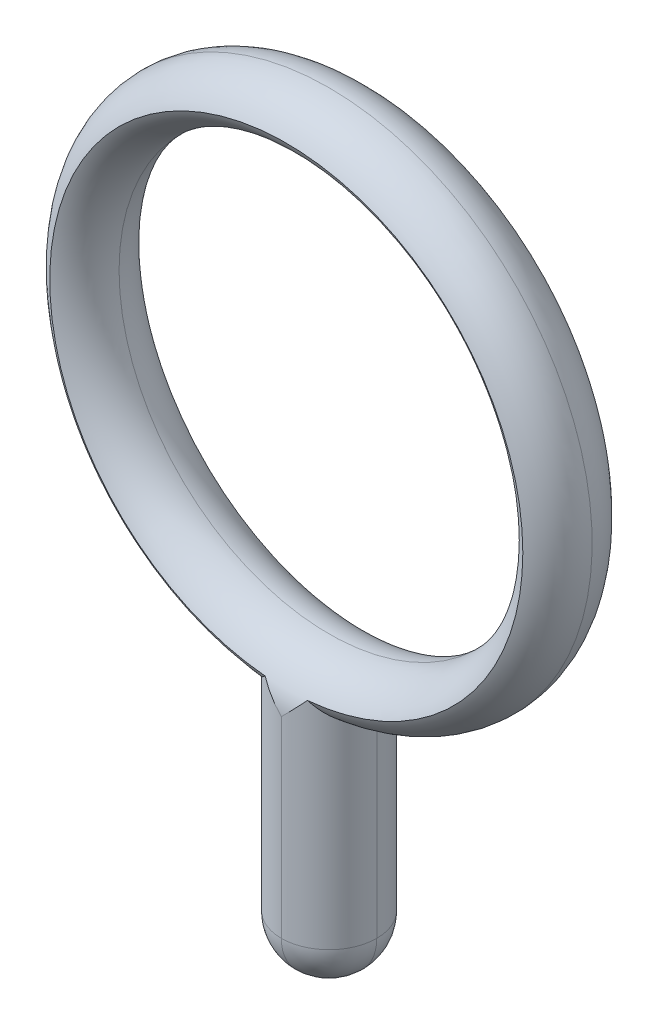
ISO-10303-21;
HEADER;
FILE_DESCRIPTION(('STEP AP214'),'2;1');
FILE_NAME('part.step','',(''),(''),'','','');
FILE_SCHEMA(('AUTOMOTIVE_DESIGN { 1 0 10303 214 1 1 1 1 }'));
ENDSEC;
DATA;
#1=APPLICATION_CONTEXT('core data for automotive mechanical design processes');
#2=APPLICATION_PROTOCOL_DEFINITION('international standard','automotive_design',2000,#1);
#3=PRODUCT_CONTEXT('',#1,'mechanical');
#4=PRODUCT('Part','Part','',(#3));
#5=PRODUCT_RELATED_PRODUCT_CATEGORY('part','',(#4));
#6=PRODUCT_DEFINITION_FORMATION('','',#4);
#7=PRODUCT_DEFINITION_CONTEXT('part definition',#1,'design');
#8=PRODUCT_DEFINITION('design','',#6,#7);
#9=PRODUCT_DEFINITION_SHAPE('','',#8);
#10=(LENGTH_UNIT() NAMED_UNIT(*) SI_UNIT(.MILLI.,.METRE.));
#11=(NAMED_UNIT(*) PLANE_ANGLE_UNIT() SI_UNIT($,.RADIAN.));
#12=(NAMED_UNIT(*) SI_UNIT($,.STERADIAN.) SOLID_ANGLE_UNIT());
#13=UNCERTAINTY_MEASURE_WITH_UNIT(LENGTH_MEASURE(1.E-05),#10,'distance_accuracy_value','');
#14=(GEOMETRIC_REPRESENTATION_CONTEXT(3) GLOBAL_UNCERTAINTY_ASSIGNED_CONTEXT((#13)) GLOBAL_UNIT_ASSIGNED_CONTEXT((#10,
#11,#12)) REPRESENTATION_CONTEXT('',''));
#15=CARTESIAN_POINT('',(0.,0.,0.));
#16=DIRECTION('',(0.,0.,1.));
#17=DIRECTION('',(1.,0.,0.));
#18=AXIS2_PLACEMENT_3D('',#15,#16,#17);
#19=CARTESIAN_POINT('',(0.,0.,2.5));
#20=DIRECTION('',(0.,0.,1.));
#21=DIRECTION('',(1.,0.,0.));
#22=AXIS2_PLACEMENT_3D('',#19,#20,#21);
#23=PLANE('',#22);
#24=DIRECTION('',(0.,1.,0.));
#25=VECTOR('',#24,1.);
#26=CARTESIAN_POINT('',(9.99999999978882E-05,-6.77654510339896,2.5));
#27=LINE('',#26,#25);
#28=CARTESIAN_POINT('',(9.99999999996231E-05,-11.778649847124,2.5));
#29=VERTEX_POINT('',#28);
#30=CARTESIAN_POINT('',(9.9999999997879E-05,-6.74989999925925,2.5));
#31=VERTEX_POINT('',#30);
#32=EDGE_CURVE('E263',#29,#31,#27,.T.);
#33=ORIENTED_EDGE('',*,*,#32,.T.);
#34=CARTESIAN_POINT('',(0.,0.,2.5));
#35=DIRECTION('',(0.,0.,1.));
#36=DIRECTION('',(1.,0.,0.));
#37=AXIS2_PLACEMENT_3D('',#34,#35,#36);
#38=CIRCLE('',#37,6.7499);
#39=CARTESIAN_POINT('',(-0.000100000000000057,-6.74989999925925,2.5));
#40=VERTEX_POINT('',#39);
#41=EDGE_CURVE('E265',#31,#40,#38,.F.);
#42=ORIENTED_EDGE('',*,*,#41,.T.);
#43=DIRECTION('',(0.,-1.,0.));
#44=VECTOR('',#43,1.);
#45=CARTESIAN_POINT('',(-0.000100000000000057,-13.028549847124,2.5));
#46=LINE('',#45,#44);
#47=CARTESIAN_POINT('',(-0.000100000000000057,-11.778649847124,2.5));
#48=VERTEX_POINT('',#47);
#49=EDGE_CURVE('E261',#40,#48,#46,.T.);
#50=ORIENTED_EDGE('',*,*,#49,.T.);
#51=DIRECTION('',(1.,0.,0.));
#52=VECTOR('',#51,1.);
#53=CARTESIAN_POINT('',(1.25,-11.778649847124,2.5));
#54=LINE('',#53,#52);
#55=EDGE_CURVE('E259',#48,#29,#54,.T.);
#56=ORIENTED_EDGE('',*,*,#55,.T.);
#57=EDGE_LOOP('',(#33,#42,#50,#56));
#58=FACE_BOUND('',#57,.T.);
#59=ADVANCED_FACE('F33',(#58),#23,.T.);
#60=CARTESIAN_POINT('',(0.,0.,0.));
#61=DIRECTION('',(0.,0.,1.));
#62=DIRECTION('',(1.,0.,0.));
#63=AXIS2_PLACEMENT_3D('',#60,#61,#62);
#64=PLANE('',#63);
#65=DIRECTION('',(0.,-1.,0.));
#66=VECTOR('',#65,1.);
#67=CARTESIAN_POINT('',(-0.000100000000000057,0.,0.));
#68=LINE('',#67,#66);
#69=CARTESIAN_POINT('',(-0.000100000000000057,-11.778649847124,0.));
#70=VERTEX_POINT('',#69);
#71=CARTESIAN_POINT('',(-0.000100000000000057,-6.74989999925925,0.));
#72=VERTEX_POINT('',#71);
#73=EDGE_CURVE('E248',#70,#72,#68,.F.);
#74=ORIENTED_EDGE('',*,*,#73,.T.);
#75=CARTESIAN_POINT('',(0.,0.,0.));
#76=DIRECTION('',(0.,0.,1.));
#77=DIRECTION('',(1.,0.,0.));
#78=AXIS2_PLACEMENT_3D('',#75,#76,#77);
#79=CIRCLE('',#78,6.7499);
#80=CARTESIAN_POINT('',(9.9999999997879E-05,-6.74989999925925,0.));
#81=VERTEX_POINT('',#80);
#82=EDGE_CURVE('E251',#72,#81,#79,.T.);
#83=ORIENTED_EDGE('',*,*,#82,.T.);
#84=DIRECTION('',(0.,1.,0.));
#85=VECTOR('',#84,1.);
#86=CARTESIAN_POINT('',(9.99999999955379E-05,0.,0.));
#87=LINE('',#86,#85);
#88=CARTESIAN_POINT('',(9.99999999996231E-05,-11.778649847124,0.));
#89=VERTEX_POINT('',#88);
#90=EDGE_CURVE('E80',#81,#89,#87,.F.);
#91=ORIENTED_EDGE('',*,*,#90,.T.);
#92=DIRECTION('',(1.,0.,0.));
#93=VECTOR('',#92,1.);
#94=CARTESIAN_POINT('',(0.,-11.778649847124,0.));
#95=LINE('',#94,#93);
#96=EDGE_CURVE('E244',#89,#70,#95,.F.);
#97=ORIENTED_EDGE('',*,*,#96,.T.);
#98=EDGE_LOOP('',(#74,#83,#91,#97));
#99=FACE_BOUND('',#98,.T.);
#100=ADVANCED_FACE('F352',(#99),#64,.F.);
#101=CARTESIAN_POINT('',(1.25,-13.028549847124,2.5));
#102=DIRECTION('',(-1.,0.,0.));
#103=DIRECTION('',(0.,-1.,0.));
#104=AXIS2_PLACEMENT_3D('',#101,#102,#103);
#105=PLANE('',#104);
#106=DIRECTION('',(0.,0.,-1.));
#107=VECTOR('',#106,1.);
#108=CARTESIAN_POINT('',(1.25,-11.778649847124,2.5));
#109=LINE('',#108,#107);
#110=CARTESIAN_POINT('',(1.25,-11.778649847124,1.2501));
#111=VERTEX_POINT('',#110);
#112=CARTESIAN_POINT('',(1.25,-11.778649847124,1.2499));
#113=VERTEX_POINT('',#112);
#114=EDGE_CURVE('E268',#111,#113,#109,.T.);
#115=ORIENTED_EDGE('',*,*,#114,.T.);
#116=DIRECTION('',(0.,1.,0.));
#117=VECTOR('',#116,1.);
#118=CARTESIAN_POINT('',(1.25,-13.028549847124,1.2499));
#119=LINE('',#118,#117);
#120=CARTESIAN_POINT('',(1.24999999999999,-6.77654510339896,1.2499));
#121=VERTEX_POINT('',#120);
#122=EDGE_CURVE('E272',#113,#121,#119,.T.);
#123=ORIENTED_EDGE('',*,*,#122,.T.);
#124=DIRECTION('',(0.,0.,-1.));
#125=VECTOR('',#124,1.);
#126=CARTESIAN_POINT('',(1.24999999999999,-6.77654510339896,2.5));
#127=LINE('',#126,#125);
#128=CARTESIAN_POINT('',(1.24999999999999,-6.77654510339896,1.2501));
#129=VERTEX_POINT('',#128);
#130=EDGE_CURVE('E238',#129,#121,#127,.T.);
#131=ORIENTED_EDGE('',*,*,#130,.F.);
#132=DIRECTION('',(0.,1.,0.));
#133=VECTOR('',#132,1.);
#134=CARTESIAN_POINT('',(1.25,-13.028549847124,1.2501));
#135=LINE('',#134,#133);
#136=EDGE_CURVE('E270',#129,#111,#135,.F.);
#137=ORIENTED_EDGE('',*,*,#136,.T.);
#138=EDGE_LOOP('',(#115,#123,#131,#137));
#139=FACE_BOUND('',#138,.T.);
#140=ADVANCED_FACE('F358',(#139),#105,.F.);
#141=CARTESIAN_POINT('',(0.,0.,2.5));
#142=DIRECTION('',(0.,0.,-1.));
#143=DIRECTION('',(-1.,0.,0.));
#144=AXIS2_PLACEMENT_3D('',#141,#142,#143);
#145=CYLINDRICAL_SURFACE('',#144,6.89086812661514);
#146=ORIENTED_EDGE('',*,*,#130,.T.);
#147=CARTESIAN_POINT('',(0.,0.,1.2499));
#148=DIRECTION('',(0.,0.,1.));
#149=DIRECTION('',(1.,0.,0.));
#150=AXIS2_PLACEMENT_3D('',#147,#148,#149);
#151=CIRCLE('',#150,6.89086812661514);
#152=CARTESIAN_POINT('',(-1.25,-6.77654510339896,1.2499));
#153=VERTEX_POINT('',#152);
#154=EDGE_CURVE('E277',#121,#153,#151,.T.);
#155=ORIENTED_EDGE('',*,*,#154,.T.);
#156=DIRECTION('',(0.,0.,-1.));
#157=VECTOR('',#156,1.);
#158=CARTESIAN_POINT('',(-1.25,-6.77654510339896,2.5));
#159=LINE('',#158,#157);
#160=CARTESIAN_POINT('',(-1.25,-6.77654510339896,1.2501));
#161=VERTEX_POINT('',#160);
#162=EDGE_CURVE('E236',#161,#153,#159,.T.);
#163=ORIENTED_EDGE('',*,*,#162,.F.);
#164=CARTESIAN_POINT('',(0.,0.,1.2501));
#165=DIRECTION('',(0.,0.,1.));
#166=DIRECTION('',(1.,0.,0.));
#167=AXIS2_PLACEMENT_3D('',#164,#165,#166);
#168=CIRCLE('',#167,6.89086812661514);
#169=EDGE_CURVE('E275',#161,#129,#168,.F.);
#170=ORIENTED_EDGE('',*,*,#169,.T.);
#171=EDGE_LOOP('',(#146,#155,#163,#170));
#172=FACE_BOUND('',#171,.T.);
#173=ADVANCED_FACE('F367',(#172),#145,.T.);
#174=CARTESIAN_POINT('',(-1.25,-13.028549847124,2.5));
#175=DIRECTION('',(1.,0.,0.));
#176=DIRECTION('',(0.,0.,-1.));
#177=AXIS2_PLACEMENT_3D('',#174,#175,#176);
#178=PLANE('',#177);
#179=ORIENTED_EDGE('',*,*,#162,.T.);
#180=DIRECTION('',(0.,-1.,0.));
#181=VECTOR('',#180,1.);
#182=CARTESIAN_POINT('',(-1.25,-13.028549847124,1.2499));
#183=LINE('',#182,#181);
#184=CARTESIAN_POINT('',(-1.25,-11.778649847124,1.2499));
#185=VERTEX_POINT('',#184);
#186=EDGE_CURVE('E141',#153,#185,#183,.T.);
#187=ORIENTED_EDGE('',*,*,#186,.T.);
#188=DIRECTION('',(0.,0.,-1.));
#189=VECTOR('',#188,1.);
#190=CARTESIAN_POINT('',(-1.25,-11.778649847124,2.5));
#191=LINE('',#190,#189);
#192=CARTESIAN_POINT('',(-1.25,-11.778649847124,1.2501));
#193=VERTEX_POINT('',#192);
#194=EDGE_CURVE('E156',#185,#193,#191,.F.);
#195=ORIENTED_EDGE('',*,*,#194,.T.);
#196=DIRECTION('',(0.,-1.,0.));
#197=VECTOR('',#196,1.);
#198=CARTESIAN_POINT('',(-1.25,-6.77654510339896,1.2501));
#199=LINE('',#198,#197);
#200=EDGE_CURVE('E280',#193,#161,#199,.F.);
#201=ORIENTED_EDGE('',*,*,#200,.T.);
#202=EDGE_LOOP('',(#179,#187,#195,#201));
#203=FACE_BOUND('',#202,.T.);
#204=ADVANCED_FACE('F364',(#203),#178,.F.);
#205=CARTESIAN_POINT('',(-1.25,-13.028549847124,2.5));
#206=DIRECTION('',(0.,1.,0.));
#207=DIRECTION('',(0.,0.,1.));
#208=AXIS2_PLACEMENT_3D('',#205,#206,#207);
#209=PLANE('',#208);
#210=DIRECTION('',(1.,0.,0.));
#211=VECTOR('',#210,1.);
#212=CARTESIAN_POINT('',(-1.25,-13.028549847124,1.2499));
#213=LINE('',#212,#211);
#214=CARTESIAN_POINT('',(-0.000100000000000057,-13.028549847124,1.2499));
#215=VERTEX_POINT('',#214);
#216=CARTESIAN_POINT('',(9.99999999996231E-05,-13.028549847124,1.2499));
#217=VERTEX_POINT('',#216);
#218=EDGE_CURVE('E43',#215,#217,#213,.T.);
#219=ORIENTED_EDGE('',*,*,#218,.T.);
#220=DIRECTION('',(0.,0.,-1.));
#221=VECTOR('',#220,1.);
#222=CARTESIAN_POINT('',(9.9999999999623E-05,-13.028549847124,2.5));
#223=LINE('',#222,#221);
#224=CARTESIAN_POINT('',(9.99999999996231E-05,-13.028549847124,1.2501));
#225=VERTEX_POINT('',#224);
#226=EDGE_CURVE('E11',#217,#225,#223,.F.);
#227=ORIENTED_EDGE('',*,*,#226,.T.);
#228=DIRECTION('',(1.,0.,0.));
#229=VECTOR('',#228,1.);
#230=CARTESIAN_POINT('',(-1.25,-13.028549847124,1.2501));
#231=LINE('',#230,#229);
#232=CARTESIAN_POINT('',(-0.000100000000000057,-13.028549847124,1.2501));
#233=VERTEX_POINT('',#232);
#234=EDGE_CURVE('E136',#225,#233,#231,.F.);
#235=ORIENTED_EDGE('',*,*,#234,.T.);
#236=DIRECTION('',(0.,0.,-1.));
#237=VECTOR('',#236,1.);
#238=CARTESIAN_POINT('',(-0.000100000000000057,-13.028549847124,2.5));
#239=LINE('',#238,#237);
#240=EDGE_CURVE('E132',#233,#215,#239,.T.);
#241=ORIENTED_EDGE('',*,*,#240,.T.);
#242=EDGE_LOOP('',(#219,#227,#235,#241));
#243=FACE_BOUND('',#242,.T.);
#244=ADVANCED_FACE('F134',(#243),#209,.F.);
#245=CARTESIAN_POINT('',(0.,0.,2.5));
#246=DIRECTION('',(0.,0.,-1.));
#247=DIRECTION('',(-1.,0.,0.));
#248=AXIS2_PLACEMENT_3D('',#245,#246,#247);
#249=CYLINDRICAL_SURFACE('',#248,5.5);
#250=CARTESIAN_POINT('',(0.,0.,1.2499));
#251=DIRECTION('',(0.,0.,1.));
#252=DIRECTION('',(1.,0.,0.));
#253=AXIS2_PLACEMENT_3D('',#250,#251,#252);
#254=CIRCLE('',#253,5.5);
#255=CARTESIAN_POINT('',(5.5,0.,1.2499));
#256=VERTEX_POINT('',#255);
#257=EDGE_CURVE('E256',#256,#256,#254,.F.);
#258=ORIENTED_EDGE('',*,*,#257,.T.);
#259=EDGE_LOOP('',(#258));
#260=FACE_BOUND('',#259,.T.);
#261=CARTESIAN_POINT('',(0.,0.,1.2501));
#262=DIRECTION('',(0.,0.,1.));
#263=DIRECTION('',(1.,0.,0.));
#264=AXIS2_PLACEMENT_3D('',#261,#262,#263);
#265=CIRCLE('',#264,5.5);
#266=CARTESIAN_POINT('',(5.5,0.,1.2501));
#267=VERTEX_POINT('',#266);
#268=EDGE_CURVE('E253',#267,#267,#265,.T.);
#269=ORIENTED_EDGE('',*,*,#268,.T.);
#270=EDGE_LOOP('',(#269));
#271=FACE_BOUND('',#270,.T.);
#272=ADVANCED_FACE('F219',(#260,#271),#249,.F.);
#273=CARTESIAN_POINT('',(0.,0.,1.2501));
#274=DIRECTION('',(0.,0.,1.));
#275=DIRECTION('',(1.,0.,0.));
#276=AXIS2_PLACEMENT_3D('',#273,#274,#275);
#277=TOROIDAL_SURFACE('',#276,5.64096812661514,1.2499);
#278=CARTESIAN_POINT('',(0.,0.,2.37028638406641));
#279=DIRECTION('',(0.,0.,1.));
#280=DIRECTION('',(1.,0.,0.));
#281=AXIS2_PLACEMENT_3D('',#278,#279,#280);
#282=CIRCLE('',#281,6.19543406330757);
#283=CARTESIAN_POINT('',(0.554565936692405,-6.17056398189436,2.37028638406642));
#284=VERTEX_POINT('',#283);
#285=CARTESIAN_POINT('',(-0.554565936692431,-6.17056398189438,2.37028638406641));
#286=VERTEX_POINT('',#285);
#287=EDGE_CURVE('E37',#284,#286,#282,.T.);
#288=ORIENTED_EDGE('',*,*,#287,.F.);
#289=CARTESIAN_POINT('',(1.25,-6.77654510339896,1.2501));
#290=CARTESIAN_POINT('',(1.25000302329412,-6.77654708426435,1.27938214554928));
#291=CARTESIAN_POINT('',(1.2489701130916,-6.77568786500602,1.3086477741594));
#292=CARTESIAN_POINT('',(1.24487093556194,-6.77227459535146,1.36692144080503));
#293=CARTESIAN_POINT('',(1.24180575369463,-6.76972144970046,1.3959296079766));
#294=CARTESIAN_POINT('',(1.22967763848456,-6.75961090304189,1.4818546486924));
#295=CARTESIAN_POINT('',(1.21768084748406,-6.74960144347235,1.53810906788582));
#296=CARTESIAN_POINT('',(1.18665734618223,-6.72362354641573,1.64701396782045));
#297=CARTESIAN_POINT('',(1.16764272163082,-6.7076653530601,1.69967046103869));
#298=CARTESIAN_POINT('',(1.12363159370701,-6.67055119125073,1.80051880748827));
#299=CARTESIAN_POINT('',(1.09862541085526,-6.64938681061011,1.84870325947881));
#300=CARTESIAN_POINT('',(1.03526317184712,-6.5954445958544,1.95404967168192));
#301=CARTESIAN_POINT('',(0.995171633918566,-6.56110040746148,2.0093652519799));
#302=CARTESIAN_POINT('',(0.909028179507402,-6.48661713417045,2.11064485938731));
#303=CARTESIAN_POINT('',(0.862967086845452,-6.44646911664006,2.15659420335288));
#304=CARTESIAN_POINT('',(0.751848778132955,-6.34859217702582,2.25211407588086));
#305=CARTESIAN_POINT('',(0.6853398863685,-6.28927954917254,2.29836382876531));
#306=CARTESIAN_POINT('',(0.5486357823578,-6.1654524438389,2.37595614715856));
#307=CARTESIAN_POINT('',(0.478436246621888,-6.10093181574973,2.40728077584774));
#308=CARTESIAN_POINT('',(0.340763594459026,-5.97224423519993,2.45475287101028));
#309=CARTESIAN_POINT('',(0.273367279350015,-5.908272212648,2.47167263283585));
#310=CARTESIAN_POINT('',(0.138798527869245,-5.77836394914129,2.49414782440753));
#311=CARTESIAN_POINT('',(0.0716259073594412,-5.71243150283838,2.49972392169305));
#312=CARTESIAN_POINT('',(0.00343355777977364,-5.64430088965892,2.49999666427235));
#313=CARTESIAN_POINT('',(0.00176657075144899,-5.64263467090914,2.49999999736394));
#314=CARTESIAN_POINT('',(9.99999999974944E-05,-5.64096812572877,2.5));
#315=B_SPLINE_CURVE_WITH_KNOTS('',3,(#289,#290,#291,#292,#293,#294,#295,#296,#297,#298,#299,
#300,#301,#302,#303,#304,#305,#306,#307,#308,#309,#310,#311,#312,#313,#314),.UNSPECIFIED.,.F.,
.F.,(4,2,2,2,2,2,2,2,2,2,2,2,4),(0.,0.0877839200167928,0.175520991354608,0.349703321603657,
0.523587073184519,0.697753654226231,0.925902553066981,1.15440640848641,1.45399965461546,
1.75395204548523,2.03657482013367,2.31868220863177,2.32575300084718),.UNSPECIFIED.);
#316=EDGE_CURVE('E222',#129,#284,#315,.T.);
#317=ORIENTED_EDGE('',*,*,#316,.F.);
#318=ORIENTED_EDGE('',*,*,#169,.F.);
#319=CARTESIAN_POINT('',(-1.25,-6.77654510339896,1.2501));
#320=CARTESIAN_POINT('',(-1.25000302329412,-6.77654708426435,1.27938214554928));
#321=CARTESIAN_POINT('',(-1.2489701130916,-6.77568786500602,1.3086477741594));
#322=CARTESIAN_POINT('',(-1.24487093556194,-6.77227459535146,1.36692144080503));
#323=CARTESIAN_POINT('',(-1.24180575369463,-6.76972144970046,1.3959296079766));
#324=CARTESIAN_POINT('',(-1.22967763848456,-6.75961090304189,1.4818546486924));
#325=CARTESIAN_POINT('',(-1.21768084748407,-6.74960144347235,1.53810906788582));
#326=CARTESIAN_POINT('',(-1.18665734618223,-6.72362354641573,1.64701396782045));
#327=CARTESIAN_POINT('',(-1.16764272163083,-6.7076653530601,1.69967046103869));
#328=CARTESIAN_POINT('',(-1.12363159370701,-6.67055119125072,1.80051880748827));
#329=CARTESIAN_POINT('',(-1.09862541085526,-6.6493868106101,1.84870325947881));
#330=CARTESIAN_POINT('',(-1.03526317184713,-6.5954445958544,1.95404967168192));
#331=CARTESIAN_POINT('',(-0.995171633918569,-6.56110040746148,2.0093652519799));
#332=CARTESIAN_POINT('',(-0.909028179507405,-6.48661713417045,2.11064485938731));
#333=CARTESIAN_POINT('',(-0.862967086845455,-6.44646911664006,2.15659420335288));
#334=CARTESIAN_POINT('',(-0.751848778132957,-6.34859217702582,2.25211407588086));
#335=CARTESIAN_POINT('',(-0.6853398863685,-6.28927954917254,2.29836382876531));
#336=CARTESIAN_POINT('',(-0.548635782357805,-6.1654524438389,2.37595614715856));
#337=CARTESIAN_POINT('',(-0.4784362466219,-6.10093181574972,2.40728077584774));
#338=CARTESIAN_POINT('',(-0.340763594459022,-5.97224423519994,2.45475287101028));
#339=CARTESIAN_POINT('',(-0.27336727934999,-5.90827221264803,2.47167263283585));
#340=CARTESIAN_POINT('',(-0.138798527869277,-5.77836394914127,2.49414782440753));
#341=CARTESIAN_POINT('',(-0.0716259073595519,-5.71243150283827,2.49972392169305));
#342=CARTESIAN_POINT('',(-0.00343355777978153,-5.64430088965892,2.49999666427235));
#343=CARTESIAN_POINT('',(-0.00176657075145428,-5.64263467090913,2.49999999736394));
#344=CARTESIAN_POINT('',(-0.000100000000000057,-5.64096812572877,2.5));
#345=B_SPLINE_CURVE_WITH_KNOTS('',3,(#319,#320,#321,#322,#323,#324,#325,#326,#327,#328,#329,
#330,#331,#332,#333,#334,#335,#336,#337,#338,#339,#340,#341,#342,#343,#344),.UNSPECIFIED.,.F.,
.F.,(4,2,2,2,2,2,2,2,2,2,2,2,4),(0.,0.0877839200167927,0.175520991354608,0.349703321603657,
0.523587073184519,0.69775365422623,0.925902553066979,1.15440640848641,1.45399965461547,
1.75395204548523,2.03657482013366,2.31868220863177,2.32575300084718),.UNSPECIFIED.);
#346=EDGE_CURVE('E198',#286,#161,#345,.F.);
#347=ORIENTED_EDGE('',*,*,#346,.F.);
#348=EDGE_LOOP('',(#288,#317,#318,#347));
#349=FACE_BOUND('',#348,.T.);
#350=ADVANCED_FACE('F216',(#349),#277,.T.);
#351=CARTESIAN_POINT('',(0.,0.,1.2501));
#352=DIRECTION('',(0.,0.,1.));
#353=DIRECTION('',(1.,0.,0.));
#354=AXIS2_PLACEMENT_3D('',#351,#352,#353);
#355=TOROIDAL_SURFACE('',#354,6.7499,1.2499);
#356=ORIENTED_EDGE('',*,*,#268,.F.);
#357=EDGE_LOOP('',(#356));
#358=FACE_BOUND('',#357,.T.);
#359=CARTESIAN_POINT('',(-1.10248951153496,-5.53885291321932,1.83915634268525));
#360=CARTESIAN_POINT('',(-1.08041212872912,-5.565765058535,1.88042324994455));
#361=CARTESIAN_POINT('',(-1.05662520378784,-5.59455072330001,1.91941460606164));
#362=CARTESIAN_POINT('',(-1.00628592188759,-5.65495592179072,1.99295492462102));
#363=CARTESIAN_POINT('',(-0.979742346659271,-5.68656641426562,2.02751725536311));
#364=CARTESIAN_POINT('',(-0.924606056536851,-5.75164118409932,2.09231821283024));
#365=CARTESIAN_POINT('',(-0.896030098936966,-5.7850898792111,2.12258716084576));
#366=CARTESIAN_POINT('',(-0.837003979386151,-5.85355608588776,2.17935813265796));
#367=CARTESIAN_POINT('',(-0.80655202695665,-5.88857508722621,2.2058564753465));
#368=CARTESIAN_POINT('',(-0.737276904500334,-5.96750680977484,2.2606306689166));
#369=CARTESIAN_POINT('',(-0.698076090625154,-6.01169401104907,2.28803454396226));
#370=CARTESIAN_POINT('',(-0.617765667225848,-6.10120294038118,2.33774462566234));
#371=CARTESIAN_POINT('',(-0.57665468362674,-6.14652547398866,2.36004709213019));
#372=CARTESIAN_POINT('',(-0.450791569277947,-6.28371981308331,2.41961176359283));
#373=CARTESIAN_POINT('',(-0.363596597045146,-6.37671856091984,2.44946419041234));
#374=CARTESIAN_POINT('',(-0.230345271916954,-6.51574899909048,2.47944061866929));
#375=CARTESIAN_POINT('',(-0.185752418334115,-6.56178044236435,2.48696434529667));
#376=CARTESIAN_POINT('',(-0.0958765772276857,-6.65359004755579,2.49714341720448));
#377=CARTESIAN_POINT('',(-0.05059507673583,-6.69936852586854,2.49980806848517));
#378=CARTESIAN_POINT('',(-0.00343284295441509,-6.7465664920391,2.49999666597053));
#379=CARTESIAN_POINT('',(-0.00176656122737713,-6.74823341582799,2.49999999905937));
#380=CARTESIAN_POINT('',(-0.000100000000000057,-6.74989999925925,2.5));
#381=B_SPLINE_CURVE_WITH_KNOTS('',3,(#359,#360,#361,#362,#363,#364,#365,#366,#367,#368,#369,
#370,#371,#372,#373,#374,#375,#376,#377,#378,#379,#380),.UNSPECIFIED.,.F.,.F.,(4,2,2,2,2,2,2,2,
2,2,4),(0.,0.161701170912621,0.32290216189188,0.482901020700998,0.643055024518407,
0.83812531048962,1.03333816046831,1.42420463578157,1.61767017980458,1.81076481192021,
1.81783560407138),.UNSPECIFIED.);
#382=EDGE_CURVE('E189',#40,#286,#381,.F.);
#383=ORIENTED_EDGE('',*,*,#382,.F.);
#384=ORIENTED_EDGE('',*,*,#41,.F.);
#385=CARTESIAN_POINT('',(9.9999999997879E-05,-6.74989999925925,2.5));
#386=CARTESIAN_POINT('',(0.00176652420943567,-6.74823345933956,2.49999999443033));
#387=CARTESIAN_POINT('',(0.00343280593979415,-6.74656653545027,2.49999666160417));
#388=CARTESIAN_POINT('',(0.105180412693507,-6.64474145085146,2.4995900578761));
#389=CARTESIAN_POINT('',(0.204356466445141,-6.54322847177546,2.487191546638));
#390=CARTESIAN_POINT('',(0.349249890669752,-6.39141871485444,2.45128240935793));
#391=CARTESIAN_POINT('',(0.397014053089055,-6.34076940669718,2.43636991522026));
#392=CARTESIAN_POINT('',(0.490903381960743,-6.24001869517987,2.40069931521275));
#393=CARTESIAN_POINT('',(0.537029335309415,-6.18991703699216,2.37994405981563));
#394=CARTESIAN_POINT('',(0.649699323133897,-6.06605805901904,2.32066516204114));
#395=CARTESIAN_POINT('',(0.71500661360187,-5.99291018831425,2.27843635572272));
#396=CARTESIAN_POINT('',(0.83915695223192,-5.85139579373564,2.17987433368805));
#397=CARTESIAN_POINT('',(0.898035538145693,-5.78300383196021,2.12362496360505));
#398=CARTESIAN_POINT('',(0.980080957108966,-5.68616537451079,2.02707894672974));
#399=CARTESIAN_POINT('',(1.00652662525499,-5.65466887895594,1.99261842564226));
#400=CARTESIAN_POINT('',(1.05671773437297,-5.5944378599685,1.91926423903081));
#401=CARTESIAN_POINT('',(1.08045096648936,-5.5657159082026,1.88035199438677));
#402=CARTESIAN_POINT('',(1.10248951153495,-5.53885291321932,1.83915634268525));
#403=B_SPLINE_CURVE_WITH_KNOTS('',3,(#385,#386,#387,#388,#389,#390,#391,#392,#393,#394,#395,
#396,#397,#398,#399,#400,#401,#402),.UNSPECIFIED.,.F.,.F.,(4,2,2,2,2,2,2,2,4),(0.,
0.00707079215116605,0.431826458521357,0.645245426632828,0.858560455226595,1.17781755254824,
1.4952094088855,1.65589062634533,1.81726874779096),.UNSPECIFIED.);
#404=EDGE_CURVE('E228',#284,#31,#403,.F.);
#405=ORIENTED_EDGE('',*,*,#404,.F.);
#406=ORIENTED_EDGE('',*,*,#287,.T.);
#407=EDGE_LOOP('',(#383,#384,#405,#406));
#408=FACE_BOUND('',#407,.T.);
#409=ADVANCED_FACE('F206',(#358,#408),#355,.T.);
#410=CARTESIAN_POINT('',(9.99999999955379E-05,0.,1.2501));
#411=DIRECTION('',(0.,-1.,0.));
#412=DIRECTION('',(1.,0.,0.));
#413=AXIS2_PLACEMENT_3D('',#410,#411,#412);
#414=CYLINDRICAL_SURFACE('',#413,1.2499);
#415=ORIENTED_EDGE('',*,*,#404,.T.);
#416=ORIENTED_EDGE('',*,*,#32,.F.);
#417=CARTESIAN_POINT('',(9.9999999999623E-05,-11.778649847124,1.2501));
#418=DIRECTION('',(0.,-1.,0.));
#419=DIRECTION('',(0.,0.,-1.));
#420=AXIS2_PLACEMENT_3D('',#417,#418,#419);
#421=CIRCLE('',#420,1.2499);
#422=EDGE_CURVE('E183',#111,#29,#421,.T.);
#423=ORIENTED_EDGE('',*,*,#422,.F.);
#424=ORIENTED_EDGE('',*,*,#136,.F.);
#425=ORIENTED_EDGE('',*,*,#316,.T.);
#426=EDGE_LOOP('',(#415,#416,#423,#424,#425));
#427=FACE_BOUND('',#426,.T.);
#428=ADVANCED_FACE('F214',(#427),#414,.T.);
#429=CARTESIAN_POINT('',(-0.000100000000000057,0.,1.2501));
#430=DIRECTION('',(0.,1.,0.));
#431=DIRECTION('',(0.,0.,1.));
#432=AXIS2_PLACEMENT_3D('',#429,#430,#431);
#433=CYLINDRICAL_SURFACE('',#432,1.2499);
#434=ORIENTED_EDGE('',*,*,#346,.T.);
#435=ORIENTED_EDGE('',*,*,#200,.F.);
#436=CARTESIAN_POINT('',(-0.000100000000000057,-11.778649847124,1.2501));
#437=DIRECTION('',(0.,-1.,0.));
#438=DIRECTION('',(0.,0.,-1.));
#439=AXIS2_PLACEMENT_3D('',#436,#437,#438);
#440=CIRCLE('',#439,1.2499);
#441=EDGE_CURVE('E180',#48,#193,#440,.T.);
#442=ORIENTED_EDGE('',*,*,#441,.F.);
#443=ORIENTED_EDGE('',*,*,#49,.F.);
#444=ORIENTED_EDGE('',*,*,#382,.T.);
#445=EDGE_LOOP('',(#434,#435,#442,#443,#444));
#446=FACE_BOUND('',#445,.T.);
#447=ADVANCED_FACE('F210',(#446),#433,.T.);
#448=CARTESIAN_POINT('',(0.,-11.778649847124,1.2501));
#449=DIRECTION('',(-1.,0.,0.));
#450=DIRECTION('',(0.,0.,1.));
#451=AXIS2_PLACEMENT_3D('',#448,#449,#450);
#452=CYLINDRICAL_SURFACE('',#451,1.2499);
#453=CARTESIAN_POINT('',(9.99999999996231E-05,-11.778649847124,1.2501));
#454=DIRECTION('',(1.,0.,0.));
#455=DIRECTION('',(0.,0.,-1.));
#456=AXIS2_PLACEMENT_3D('',#453,#454,#455);
#457=CIRCLE('',#456,1.2499);
#458=EDGE_CURVE('E186',#29,#225,#457,.T.);
#459=ORIENTED_EDGE('',*,*,#458,.F.);
#460=ORIENTED_EDGE('',*,*,#55,.F.);
#461=CARTESIAN_POINT('',(-0.000100000000000057,-11.778649847124,1.2501));
#462=DIRECTION('',(-1.,0.,0.));
#463=DIRECTION('',(0.,0.,1.));
#464=AXIS2_PLACEMENT_3D('',#461,#462,#463);
#465=CIRCLE('',#464,1.2499);
#466=EDGE_CURVE('E177',#233,#48,#465,.T.);
#467=ORIENTED_EDGE('',*,*,#466,.F.);
#468=ORIENTED_EDGE('',*,*,#234,.F.);
#469=EDGE_LOOP('',(#459,#460,#467,#468));
#470=FACE_BOUND('',#469,.T.);
#471=ADVANCED_FACE('F213',(#470),#452,.T.);
#472=CARTESIAN_POINT('',(9.99999999996231E-05,-11.778649847124,1.2501));
#473=DIRECTION('',(0.,0.,1.));
#474=DIRECTION('',(1.,0.,0.));
#475=AXIS2_PLACEMENT_3D('',#472,#473,#474);
#476=SPHERICAL_SURFACE('',#475,1.2499);
#477=ORIENTED_EDGE('',*,*,#422,.T.);
#478=ORIENTED_EDGE('',*,*,#458,.T.);
#479=CARTESIAN_POINT('',(9.99999999996231E-05,-11.778649847124,1.2501));
#480=DIRECTION('',(0.,0.,1.));
#481=DIRECTION('',(1.,0.,0.));
#482=AXIS2_PLACEMENT_3D('',#479,#480,#481);
#483=CIRCLE('',#482,1.2499);
#484=EDGE_CURVE('E174',#111,#225,#483,.F.);
#485=ORIENTED_EDGE('',*,*,#484,.F.);
#486=EDGE_LOOP('',(#477,#478,#485));
#487=FACE_BOUND('',#486,.T.);
#488=ADVANCED_FACE('F342',(#487),#476,.T.);
#489=CARTESIAN_POINT('',(-0.000100000000000057,-11.778649847124,1.2501));
#490=DIRECTION('',(0.,0.,1.));
#491=DIRECTION('',(1.,0.,0.));
#492=AXIS2_PLACEMENT_3D('',#489,#490,#491);
#493=SPHERICAL_SURFACE('',#492,1.2499);
#494=ORIENTED_EDGE('',*,*,#466,.T.);
#495=ORIENTED_EDGE('',*,*,#441,.T.);
#496=CARTESIAN_POINT('',(-0.000100000000000057,-11.778649847124,1.2501));
#497=DIRECTION('',(0.,0.,1.));
#498=DIRECTION('',(1.,0.,0.));
#499=AXIS2_PLACEMENT_3D('',#496,#497,#498);
#500=CIRCLE('',#499,1.2499);
#501=EDGE_CURVE('E172',#233,#193,#500,.F.);
#502=ORIENTED_EDGE('',*,*,#501,.F.);
#503=EDGE_LOOP('',(#494,#495,#502));
#504=FACE_BOUND('',#503,.T.);
#505=ADVANCED_FACE('F338',(#504),#493,.T.);
#506=CARTESIAN_POINT('',(9.99999999996231E-05,-11.778649847124,2.5));
#507=DIRECTION('',(0.,0.,-1.));
#508=DIRECTION('',(-1.,0.,0.));
#509=AXIS2_PLACEMENT_3D('',#506,#507,#508);
#510=CYLINDRICAL_SURFACE('',#509,1.2499);
#511=ORIENTED_EDGE('',*,*,#484,.T.);
#512=ORIENTED_EDGE('',*,*,#226,.F.);
#513=CARTESIAN_POINT('',(9.9999999999623E-05,-11.778649847124,1.2499));
#514=DIRECTION('',(0.,0.,-1.));
#515=DIRECTION('',(-1.,0.,0.));
#516=AXIS2_PLACEMENT_3D('',#513,#514,#515);
#517=CIRCLE('',#516,1.2499);
#518=EDGE_CURVE('E52',#113,#217,#517,.T.);
#519=ORIENTED_EDGE('',*,*,#518,.F.);
#520=ORIENTED_EDGE('',*,*,#114,.F.);
#521=EDGE_LOOP('',(#511,#512,#519,#520));
#522=FACE_BOUND('',#521,.T.);
#523=ADVANCED_FACE('F335',(#522),#510,.T.);
#524=CARTESIAN_POINT('',(-0.000100000000000057,-11.778649847124,2.5));
#525=DIRECTION('',(0.,0.,-1.));
#526=DIRECTION('',(-1.,0.,0.));
#527=AXIS2_PLACEMENT_3D('',#524,#525,#526);
#528=CYLINDRICAL_SURFACE('',#527,1.2499);
#529=ORIENTED_EDGE('',*,*,#501,.T.);
#530=ORIENTED_EDGE('',*,*,#194,.F.);
#531=CARTESIAN_POINT('',(-0.000100000000000057,-11.778649847124,1.2499));
#532=DIRECTION('',(0.,0.,-1.));
#533=DIRECTION('',(-1.,0.,0.));
#534=AXIS2_PLACEMENT_3D('',#531,#532,#533);
#535=CIRCLE('',#534,1.2499);
#536=EDGE_CURVE('E154',#215,#185,#535,.T.);
#537=ORIENTED_EDGE('',*,*,#536,.F.);
#538=ORIENTED_EDGE('',*,*,#240,.F.);
#539=EDGE_LOOP('',(#529,#530,#537,#538));
#540=FACE_BOUND('',#539,.T.);
#541=ADVANCED_FACE('F155',(#540),#528,.T.);
#542=CARTESIAN_POINT('',(-1.25,-11.778649847124,1.2499));
#543=DIRECTION('',(1.,0.,0.));
#544=DIRECTION('',(0.,0.,-1.));
#545=AXIS2_PLACEMENT_3D('',#542,#543,#544);
#546=CYLINDRICAL_SURFACE('',#545,1.2499);
#547=CARTESIAN_POINT('',(9.99999999996231E-05,-11.778649847124,1.2499));
#548=DIRECTION('',(1.,0.,0.));
#549=DIRECTION('',(0.,0.,-1.));
#550=AXIS2_PLACEMENT_3D('',#547,#548,#549);
#551=CIRCLE('',#550,1.2499);
#552=EDGE_CURVE('E149',#217,#89,#551,.T.);
#553=ORIENTED_EDGE('',*,*,#552,.F.);
#554=ORIENTED_EDGE('',*,*,#218,.F.);
#555=CARTESIAN_POINT('',(-0.000100000000000057,-11.778649847124,1.2499));
#556=DIRECTION('',(-1.,0.,0.));
#557=DIRECTION('',(0.,0.,1.));
#558=AXIS2_PLACEMENT_3D('',#555,#556,#557);
#559=CIRCLE('',#558,1.2499);
#560=EDGE_CURVE('E147',#70,#215,#559,.T.);
#561=ORIENTED_EDGE('',*,*,#560,.F.);
#562=ORIENTED_EDGE('',*,*,#96,.F.);
#563=EDGE_LOOP('',(#553,#554,#561,#562));
#564=FACE_BOUND('',#563,.T.);
#565=ADVANCED_FACE('F145',(#564),#546,.T.);
#566=CARTESIAN_POINT('',(9.99999999996231E-05,-11.778649847124,1.2499));
#567=DIRECTION('',(0.,0.,1.));
#568=DIRECTION('',(1.,0.,0.));
#569=AXIS2_PLACEMENT_3D('',#566,#567,#568);
#570=SPHERICAL_SURFACE('',#569,1.2499);
#571=ORIENTED_EDGE('',*,*,#518,.T.);
#572=ORIENTED_EDGE('',*,*,#552,.T.);
#573=CARTESIAN_POINT('',(9.99999999996231E-05,-11.778649847124,1.2499));
#574=DIRECTION('',(0.,-1.,0.));
#575=DIRECTION('',(0.,0.,-1.));
#576=AXIS2_PLACEMENT_3D('',#573,#574,#575);
#577=CIRCLE('',#576,1.2499);
#578=EDGE_CURVE('E163',#113,#89,#577,.F.);
#579=ORIENTED_EDGE('',*,*,#578,.F.);
#580=EDGE_LOOP('',(#571,#572,#579));
#581=FACE_BOUND('',#580,.T.);
#582=ADVANCED_FACE('F328',(#581),#570,.T.);
#583=CARTESIAN_POINT('',(-0.000100000000000057,-11.778649847124,1.2499));
#584=DIRECTION('',(0.,0.,1.));
#585=DIRECTION('',(1.,0.,0.));
#586=AXIS2_PLACEMENT_3D('',#583,#584,#585);
#587=SPHERICAL_SURFACE('',#586,1.2499);
#588=ORIENTED_EDGE('',*,*,#560,.T.);
#589=ORIENTED_EDGE('',*,*,#536,.T.);
#590=CARTESIAN_POINT('',(-0.000100000000000057,-11.778649847124,1.2499));
#591=DIRECTION('',(0.,-1.,0.));
#592=DIRECTION('',(0.,0.,-1.));
#593=AXIS2_PLACEMENT_3D('',#590,#591,#592);
#594=CIRCLE('',#593,1.2499);
#595=EDGE_CURVE('E161',#70,#185,#594,.F.);
#596=ORIENTED_EDGE('',*,*,#595,.F.);
#597=EDGE_LOOP('',(#588,#589,#596));
#598=FACE_BOUND('',#597,.T.);
#599=ADVANCED_FACE('F160',(#598),#587,.T.);
#600=CARTESIAN_POINT('',(0.000100000000000057,-13.028549847124,1.2499));
#601=DIRECTION('',(0.,1.,0.));
#602=DIRECTION('',(-1.,0.,0.));
#603=AXIS2_PLACEMENT_3D('',#600,#601,#602);
#604=CYLINDRICAL_SURFACE('',#603,1.2499);
#605=CARTESIAN_POINT('',(1.25,-6.77654510339896,1.2499));
#606=CARTESIAN_POINT('',(1.25000302329412,-6.77654708426435,1.22061785445072));
#607=CARTESIAN_POINT('',(1.2489701130916,-6.77568786500602,1.1913522258406));
#608=CARTESIAN_POINT('',(1.24487093556194,-6.77227459535146,1.13307855919497));
#609=CARTESIAN_POINT('',(1.24180575369463,-6.76972144970046,1.1040703920234));
#610=CARTESIAN_POINT('',(1.22967763848456,-6.75961090304189,1.0181453513076));
#611=CARTESIAN_POINT('',(1.21768084748406,-6.74960144347235,0.961890932114179));
#612=CARTESIAN_POINT('',(1.18665734618223,-6.72362354641573,0.852986032179546));
#613=CARTESIAN_POINT('',(1.16764272163083,-6.7076653530601,0.800329538961309));
#614=CARTESIAN_POINT('',(1.12363159370701,-6.67055119125072,0.699481192511729));
#615=CARTESIAN_POINT('',(1.09862541085526,-6.6493868106101,0.651296740521192));
#616=CARTESIAN_POINT('',(1.03526317184712,-6.5954445958544,0.545950328318081));
#617=CARTESIAN_POINT('',(0.995171633918566,-6.56110040746148,0.490634748020096));
#618=CARTESIAN_POINT('',(0.909028179507403,-6.48661713417045,0.389355140612694));
#619=CARTESIAN_POINT('',(0.862967086845452,-6.44646911664006,0.343405796647116));
#620=CARTESIAN_POINT('',(0.751848778132956,-6.34859217702582,0.247885924119141));
#621=CARTESIAN_POINT('',(0.6853398863685,-6.28927954917254,0.20163617123469));
#622=CARTESIAN_POINT('',(0.548635782357801,-6.1654524438389,0.124043852841439));
#623=CARTESIAN_POINT('',(0.47843624662189,-6.10093181574973,0.0927192241522586));
#624=CARTESIAN_POINT('',(0.340763594459026,-5.97224423519993,0.0452471289897208));
#625=CARTESIAN_POINT('',(0.273367279350014,-5.908272212648,0.0283273671641544));
#626=CARTESIAN_POINT('',(0.138798527869246,-5.77836394914129,0.00585217559246987));
#627=CARTESIAN_POINT('',(0.0716259073594468,-5.71243150283837,0.00027607830694865));
#628=CARTESIAN_POINT('',(0.00343355777977466,-5.64430088965892,3.3357276476874E-06));
#629=CARTESIAN_POINT('',(0.00176657075144951,-5.64263467090914,2.6360588796437E-09));
#630=CARTESIAN_POINT('',(9.99999999974944E-05,-5.64096812572877,0.));
#631=B_SPLINE_CURVE_WITH_KNOTS('',3,(#605,#606,#607,#608,#609,#610,#611,#612,#613,#614,#615,
#616,#617,#618,#619,#620,#621,#622,#623,#624,#625,#626,#627,#628,#629,#630),.UNSPECIFIED.,.F.,
.F.,(4,2,2,2,2,2,2,2,2,2,2,2,4),(0.,0.087783920016793,0.175520991354608,0.349703321603657,
0.523587073184519,0.69775365422623,0.92590255306698,1.15440640848641,1.45399965461546,
1.75395204548523,2.03657482013367,2.31868220863177,2.32575300084718),.UNSPECIFIED.);
#632=CARTESIAN_POINT('',(0.554565936692428,-6.17056398189438,0.129713615933587));
#633=VERTEX_POINT('',#632);
#634=EDGE_CURVE('E166',#121,#633,#631,.T.);
#635=ORIENTED_EDGE('',*,*,#634,.F.);
#636=ORIENTED_EDGE('',*,*,#122,.F.);
#637=ORIENTED_EDGE('',*,*,#578,.T.);
#638=ORIENTED_EDGE('',*,*,#90,.F.);
#639=CARTESIAN_POINT('',(1.10248951153495,-5.53885291321933,0.660843657314737));
#640=CARTESIAN_POINT('',(1.08041212872911,-5.56576505853501,0.619576750055439));
#641=CARTESIAN_POINT('',(1.05662520378783,-5.59455072330002,0.580585393938347));
#642=CARTESIAN_POINT('',(1.00628592188757,-5.65495592179073,0.50704507537897));
#643=CARTESIAN_POINT('',(0.979742346659258,-5.68656641426563,0.472482744636881));
#644=CARTESIAN_POINT('',(0.924606056536837,-5.75164118409934,0.407681787169752));
#645=CARTESIAN_POINT('',(0.896030098936952,-5.78508987921112,0.377412839154226));
#646=CARTESIAN_POINT('',(0.837003979386137,-5.85355608588777,0.320641867342026));
#647=CARTESIAN_POINT('',(0.806552026956638,-5.88857508722622,0.294143524653492));
#648=CARTESIAN_POINT('',(0.737276904500322,-5.96750680977486,0.239369331083396));
#649=CARTESIAN_POINT('',(0.698076090625141,-6.01169401104908,0.211965456037733));
#650=CARTESIAN_POINT('',(0.617765667225834,-6.10120294038119,0.162255374337655));
#651=CARTESIAN_POINT('',(0.576654683626726,-6.14652547398867,0.1399529078698));
#652=CARTESIAN_POINT('',(0.450791569277937,-6.28371981308332,0.0803882364071613));
#653=CARTESIAN_POINT('',(0.363596597045144,-6.37671856091987,0.0505358095876556));
#654=CARTESIAN_POINT('',(0.230345271916932,-6.51574899909048,0.0205593813307039));
#655=CARTESIAN_POINT('',(0.185752418334082,-6.56178044236434,0.0130356547033318));
#656=CARTESIAN_POINT('',(0.0958765772276983,-6.65359004755582,0.00285658279551923));
#657=CARTESIAN_POINT('',(0.0505950767358992,-6.69936852586862,0.000191931514833994));
#658=CARTESIAN_POINT('',(0.00343284295441826,-6.74656649203911,3.3340294732323E-06));
#659=CARTESIAN_POINT('',(0.00176656122737771,-6.748233415828,9.40627022327086E-10));
#660=CARTESIAN_POINT('',(9.9999999997879E-05,-6.74989999925925,0.));
#661=B_SPLINE_CURVE_WITH_KNOTS('',3,(#639,#640,#641,#642,#643,#644,#645,#646,#647,#648,#649,
#650,#651,#652,#653,#654,#655,#656,#657,#658,#659,#660),.UNSPECIFIED.,.F.,.F.,(4,2,2,2,2,2,2,2,
2,2,4),(0.,0.161701170912623,0.322902161891884,0.482901020701001,0.643055024518407,
0.838125310489619,1.03333816046831,1.42420463578157,1.61767017980458,1.8107648119202,
1.81783560407136),.UNSPECIFIED.);
#662=EDGE_CURVE('E382',#633,#81,#661,.T.);
#663=ORIENTED_EDGE('',*,*,#662,.F.);
#664=EDGE_LOOP('',(#635,#636,#637,#638,#663));
#665=FACE_BOUND('',#664,.T.);
#666=ADVANCED_FACE('F323',(#665),#604,.T.);
#667=CARTESIAN_POINT('',(0.,0.,1.2499));
#668=DIRECTION('',(0.,0.,1.));
#669=DIRECTION('',(1.,0.,0.));
#670=AXIS2_PLACEMENT_3D('',#667,#668,#669);
#671=TOROIDAL_SURFACE('',#670,5.64096812661514,1.2499);
#672=CARTESIAN_POINT('',(-1.25,-6.77654510339896,1.2499));
#673=CARTESIAN_POINT('',(-1.25000302329412,-6.77654708426435,1.22061785445072));
#674=CARTESIAN_POINT('',(-1.2489701130916,-6.77568786500602,1.1913522258406));
#675=CARTESIAN_POINT('',(-1.24487093556194,-6.77227459535146,1.13307855919497));
#676=CARTESIAN_POINT('',(-1.24180575369463,-6.76972144970046,1.1040703920234));
#677=CARTESIAN_POINT('',(-1.22967763848456,-6.75961090304189,1.0181453513076));
#678=CARTESIAN_POINT('',(-1.21768084748407,-6.74960144347235,0.961890932114178));
#679=CARTESIAN_POINT('',(-1.18665734618223,-6.72362354641573,0.852986032179546));
#680=CARTESIAN_POINT('',(-1.16764272163083,-6.7076653530601,0.80032953896131));
#681=CARTESIAN_POINT('',(-1.12363159370701,-6.67055119125072,0.69948119251173));
#682=CARTESIAN_POINT('',(-1.09862541085526,-6.6493868106101,0.651296740521192));
#683=CARTESIAN_POINT('',(-1.03526317184713,-6.5954445958544,0.545950328318081));
#684=CARTESIAN_POINT('',(-0.995171633918569,-6.56110040746148,0.490634748020096));
#685=CARTESIAN_POINT('',(-0.909028179507405,-6.48661713417045,0.389355140612695));
#686=CARTESIAN_POINT('',(-0.862967086845454,-6.44646911664006,0.343405796647117));
#687=CARTESIAN_POINT('',(-0.751848778132958,-6.34859217702582,0.247885924119141));
#688=CARTESIAN_POINT('',(-0.685339886368503,-6.28927954917254,0.20163617123469));
#689=CARTESIAN_POINT('',(-0.548635782357804,-6.1654524438389,0.124043852841439));
#690=CARTESIAN_POINT('',(-0.478436246621892,-6.10093181574973,0.0927192241522586));
#691=CARTESIAN_POINT('',(-0.340763594459029,-5.97224423519993,0.0452471289897208));
#692=CARTESIAN_POINT('',(-0.273367279350016,-5.908272212648,0.0283273671641547));
#693=CARTESIAN_POINT('',(-0.138798527869248,-5.77836394914129,0.00585217559246991));
#694=CARTESIAN_POINT('',(-0.0716259073594486,-5.71243150283838,0.000276078306948276));
#695=CARTESIAN_POINT('',(-0.00343355777977715,-5.64430088965892,3.33572764766865E-06));
#696=CARTESIAN_POINT('',(-0.00176657075145203,-5.64263467090914,2.63605887006559E-09));
#697=CARTESIAN_POINT('',(-0.000100000000000057,-5.64096812572877,0.));
#698=B_SPLINE_CURVE_WITH_KNOTS('',3,(#672,#673,#674,#675,#676,#677,#678,#679,#680,#681,#682,
#683,#684,#685,#686,#687,#688,#689,#690,#691,#692,#693,#694,#695,#696,#697),.UNSPECIFIED.,.F.,
.F.,(4,2,2,2,2,2,2,2,2,2,2,2,4),(0.,0.0877839200167927,0.175520991354608,0.349703321603657,
0.523587073184519,0.69775365422623,0.92590255306698,1.15440640848641,1.45399965461546,
1.75395204548523,2.03657482013367,2.31868220863177,2.32575300084718),.UNSPECIFIED.);
#699=CARTESIAN_POINT('',(-0.554565936692271,-6.17056398189455,0.129713615933508));
#700=VERTEX_POINT('',#699);
#701=EDGE_CURVE('E308',#153,#700,#698,.T.);
#702=ORIENTED_EDGE('',*,*,#701,.F.);
#703=ORIENTED_EDGE('',*,*,#154,.F.);
#704=ORIENTED_EDGE('',*,*,#634,.T.);
#705=CARTESIAN_POINT('',(0.,0.,0.129713615933587));
#706=DIRECTION('',(0.,0.,-1.));
#707=DIRECTION('',(-1.,0.,0.));
#708=AXIS2_PLACEMENT_3D('',#705,#706,#707);
#709=CIRCLE('',#708,6.19543406330757);
#710=EDGE_CURVE('E293',#700,#633,#709,.T.);
#711=ORIENTED_EDGE('',*,*,#710,.F.);
#712=EDGE_LOOP('',(#702,#703,#704,#711));
#713=FACE_BOUND('',#712,.T.);
#714=ADVANCED_FACE('F302',(#713),#671,.T.);
#715=CARTESIAN_POINT('',(-0.000100000000000057,-13.028549847124,1.2499));
#716=DIRECTION('',(0.,-1.,0.));
#717=DIRECTION('',(0.,0.,-1.));
#718=AXIS2_PLACEMENT_3D('',#715,#716,#717);
#719=CYLINDRICAL_SURFACE('',#718,1.2499);
#720=ORIENTED_EDGE('',*,*,#186,.F.);
#721=ORIENTED_EDGE('',*,*,#701,.T.);
#722=CARTESIAN_POINT('',(-0.000100000000000057,-6.74989999925925,0.));
#723=CARTESIAN_POINT('',(-0.00176652420943785,-6.74823345933956,5.56967109845243E-09));
#724=CARTESIAN_POINT('',(-0.00343280593979633,-6.74656653545027,3.33839583216241E-06));
#725=CARTESIAN_POINT('',(-0.10518041269351,-6.64474145085146,0.000409942123905946));
#726=CARTESIAN_POINT('',(-0.204356466445143,-6.54322847177546,0.012808453362002));
#727=CARTESIAN_POINT('',(-0.349249890669754,-6.39141871485444,0.0487175906420691));
#728=CARTESIAN_POINT('',(-0.397014053089058,-6.34076940669718,0.0636300847797433));
#729=CARTESIAN_POINT('',(-0.490903381960746,-6.24001869517987,0.0993006847872513));
#730=CARTESIAN_POINT('',(-0.537029335309418,-6.18991703699216,0.12005594018437));
#731=CARTESIAN_POINT('',(-0.649699323133901,-6.06605805901904,0.17933483795886));
#732=CARTESIAN_POINT('',(-0.715006613601874,-5.99291018831425,0.221563644277284));
#733=CARTESIAN_POINT('',(-0.839156952231924,-5.85139579373564,0.320125666311955));
#734=CARTESIAN_POINT('',(-0.898035538145697,-5.78300383196021,0.376375036394955));
#735=CARTESIAN_POINT('',(-0.980080957108968,-5.68616537451079,0.47292105327026));
#736=CARTESIAN_POINT('',(-1.00652662525499,-5.65466887895594,0.507381574357736));
#737=CARTESIAN_POINT('',(-1.05671773437297,-5.5944378599685,0.580735760969182));
#738=CARTESIAN_POINT('',(-1.08045096648936,-5.56571590820261,0.619648005613214));
#739=CARTESIAN_POINT('',(-1.10248951153495,-5.53885291321933,0.660843657314735));
#740=B_SPLINE_CURVE_WITH_KNOTS('',3,(#722,#723,#724,#725,#726,#727,#728,#729,#730,#731,#732,
#733,#734,#735,#736,#737,#738,#739),.UNSPECIFIED.,.F.,.F.,(4,2,2,2,2,2,2,2,4),(0.,
0.00707079215116605,0.431826458521358,0.645245426632829,0.858560455226597,1.17781755254824,
1.49520940888551,1.65589062634532,1.81726874779094),.UNSPECIFIED.);
#741=EDGE_CURVE('E284',#72,#700,#740,.T.);
#742=ORIENTED_EDGE('',*,*,#741,.F.);
#743=ORIENTED_EDGE('',*,*,#73,.F.);
#744=ORIENTED_EDGE('',*,*,#595,.T.);
#745=EDGE_LOOP('',(#720,#721,#742,#743,#744));
#746=FACE_BOUND('',#745,.T.);
#747=ADVANCED_FACE('F297',(#746),#719,.T.);
#748=CARTESIAN_POINT('',(0.,0.,1.2499));
#749=DIRECTION('',(0.,0.,1.));
#750=DIRECTION('',(1.,0.,0.));
#751=AXIS2_PLACEMENT_3D('',#748,#749,#750);
#752=TOROIDAL_SURFACE('',#751,6.7499,1.2499);
#753=ORIENTED_EDGE('',*,*,#257,.F.);
#754=EDGE_LOOP('',(#753));
#755=FACE_BOUND('',#754,.T.);
#756=ORIENTED_EDGE('',*,*,#710,.T.);
#757=ORIENTED_EDGE('',*,*,#662,.T.);
#758=ORIENTED_EDGE('',*,*,#82,.F.);
#759=ORIENTED_EDGE('',*,*,#741,.T.);
#760=EDGE_LOOP('',(#756,#757,#758,#759));
#761=FACE_BOUND('',#760,.T.);
#762=ADVANCED_FACE('F301',(#755,#761),#752,.T.);
#763=CLOSED_SHELL('',(#59,#100,#140,#173,#204,#244,#272,#350,#409,#428,#447,#471,#488,#505,#523,
#541,#565,#582,#599,#666,#714,#747,#762));
#764=MANIFOLD_SOLID_BREP('B2',#763);
#765=ADVANCED_BREP_SHAPE_REPRESENTATION('',(#18,#764),#14);
#766=SHAPE_DEFINITION_REPRESENTATION(#9,#765);
ENDSEC;
END-ISO-10303-21;
